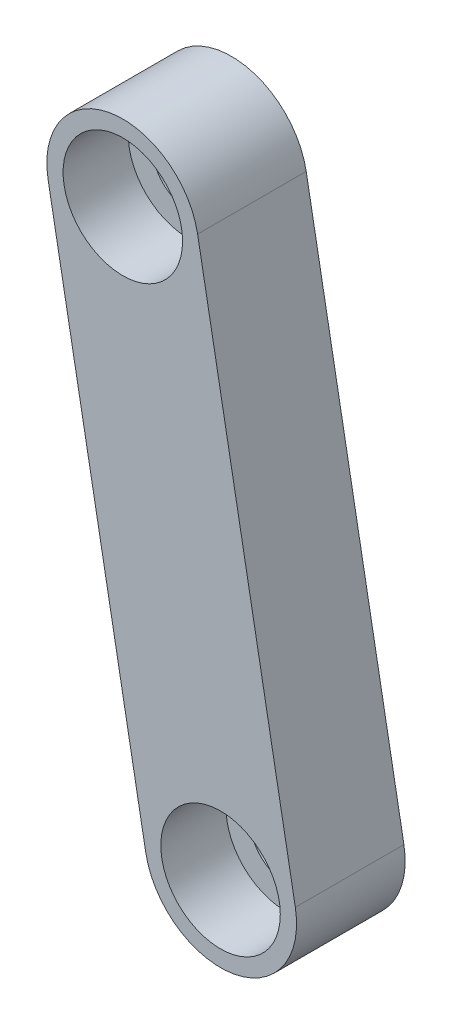
ISO-10303-21;
HEADER;
FILE_DESCRIPTION(('STEP AP214'),'2;1');
FILE_NAME('part.step','',(''),(''),'','','');
FILE_SCHEMA(('AUTOMOTIVE_DESIGN { 1 0 10303 214 1 1 1 1 }'));
ENDSEC;
DATA;
#1=APPLICATION_CONTEXT('core data for automotive mechanical design processes');
#2=APPLICATION_PROTOCOL_DEFINITION('international standard','automotive_design',2000,#1);
#3=PRODUCT_CONTEXT('',#1,'mechanical');
#4=PRODUCT('Part','Part','',(#3));
#5=PRODUCT_RELATED_PRODUCT_CATEGORY('part','',(#4));
#6=PRODUCT_DEFINITION_FORMATION('','',#4);
#7=PRODUCT_DEFINITION_CONTEXT('part definition',#1,'design');
#8=PRODUCT_DEFINITION('design','',#6,#7);
#9=PRODUCT_DEFINITION_SHAPE('','',#8);
#10=(LENGTH_UNIT() NAMED_UNIT(*) SI_UNIT(.MILLI.,.METRE.));
#11=(NAMED_UNIT(*) PLANE_ANGLE_UNIT() SI_UNIT($,.RADIAN.));
#12=(NAMED_UNIT(*) SI_UNIT($,.STERADIAN.) SOLID_ANGLE_UNIT());
#13=UNCERTAINTY_MEASURE_WITH_UNIT(LENGTH_MEASURE(1.E-05),#10,'distance_accuracy_value','');
#14=(GEOMETRIC_REPRESENTATION_CONTEXT(3) GLOBAL_UNCERTAINTY_ASSIGNED_CONTEXT((#13)) GLOBAL_UNIT_ASSIGNED_CONTEXT((#10,
#11,#12)) REPRESENTATION_CONTEXT('',''));
#15=CARTESIAN_POINT('',(0.,0.,0.));
#16=DIRECTION('',(0.,0.,1.));
#17=DIRECTION('',(1.,0.,0.));
#18=AXIS2_PLACEMENT_3D('',#15,#16,#17);
#19=CARTESIAN_POINT('',(-6.60998008883973,32.2171318150947,5.));
#20=DIRECTION('',(0.,0.,-1.));
#21=DIRECTION('',(-1.,0.,0.));
#22=AXIS2_PLACEMENT_3D('',#19,#20,#21);
#23=CYLINDRICAL_SURFACE('',#22,1.625);
#24=CARTESIAN_POINT('',(-6.60998008883973,32.2171318150947,0.));
#25=DIRECTION('',(0.,0.,1.));
#26=DIRECTION('',(1.,0.,0.));
#27=AXIS2_PLACEMENT_3D('',#24,#25,#26);
#28=CIRCLE('',#27,1.625);
#29=CARTESIAN_POINT('',(-4.98498008883973,32.2171318150947,0.));
#30=VERTEX_POINT('',#29);
#31=EDGE_CURVE('E103',#30,#30,#28,.T.);
#32=ORIENTED_EDGE('',*,*,#31,.F.);
#33=EDGE_LOOP('',(#32));
#34=FACE_BOUND('',#33,.T.);
#35=CARTESIAN_POINT('',(-6.60998008883973,32.2171318150947,2.));
#36=DIRECTION('',(0.,0.,1.));
#37=DIRECTION('',(1.,0.,0.));
#38=AXIS2_PLACEMENT_3D('',#35,#36,#37);
#39=CIRCLE('',#38,1.625);
#40=CARTESIAN_POINT('',(-4.98498008883973,32.2171318150947,2.));
#41=VERTEX_POINT('',#40);
#42=EDGE_CURVE('E37',#41,#41,#39,.T.);
#43=ORIENTED_EDGE('',*,*,#42,.T.);
#44=EDGE_LOOP('',(#43));
#45=FACE_BOUND('',#44,.T.);
#46=ADVANCED_FACE('F33',(#34,#45),#23,.F.);
#47=CARTESIAN_POINT('',(-11.1089160968687,56.8089917446661,5.));
#48=DIRECTION('',(0.,0.,-1.));
#49=DIRECTION('',(-1.,0.,0.));
#50=AXIS2_PLACEMENT_3D('',#47,#48,#49);
#51=CYLINDRICAL_SURFACE('',#50,1.625);
#52=CARTESIAN_POINT('',(-11.1089160968687,56.8089917446661,0.));
#53=DIRECTION('',(0.,0.,1.));
#54=DIRECTION('',(1.,0.,0.));
#55=AXIS2_PLACEMENT_3D('',#52,#53,#54);
#56=CIRCLE('',#55,1.625);
#57=CARTESIAN_POINT('',(-9.48391609686869,56.8089917446661,0.));
#58=VERTEX_POINT('',#57);
#59=EDGE_CURVE('E114',#58,#58,#56,.T.);
#60=ORIENTED_EDGE('',*,*,#59,.F.);
#61=EDGE_LOOP('',(#60));
#62=FACE_BOUND('',#61,.T.);
#63=CARTESIAN_POINT('',(-11.1089160968687,56.8089917446661,2.));
#64=DIRECTION('',(0.,0.,1.));
#65=DIRECTION('',(1.,0.,0.));
#66=AXIS2_PLACEMENT_3D('',#63,#64,#65);
#67=CIRCLE('',#66,1.625);
#68=CARTESIAN_POINT('',(-9.48391609686869,56.8089917446661,2.));
#69=VERTEX_POINT('',#68);
#70=EDGE_CURVE('E108',#69,#69,#67,.T.);
#71=ORIENTED_EDGE('',*,*,#70,.T.);
#72=EDGE_LOOP('',(#71));
#73=FACE_BOUND('',#72,.T.);
#74=ADVANCED_FACE('F139',(#62,#73),#51,.F.);
#75=CARTESIAN_POINT('',(-11.1089160963745,56.8089917447565,5.));
#76=DIRECTION('',(0.,0.,1.));
#77=DIRECTION('',(1.,0.,0.));
#78=AXIS2_PLACEMENT_3D('',#75,#76,#77);
#79=PLANE('',#78);
#80=CARTESIAN_POINT('',(-11.1089160968687,56.8089917446661,5.));
#81=DIRECTION('',(0.,0.,1.));
#82=DIRECTION('',(1.,0.,0.));
#83=AXIS2_PLACEMENT_3D('',#80,#81,#82);
#84=CIRCLE('',#83,2.75);
#85=CARTESIAN_POINT('',(-8.3589160968687,56.8089917446661,5.));
#86=VERTEX_POINT('',#85);
#87=EDGE_CURVE('E116',#86,#86,#84,.T.);
#88=ORIENTED_EDGE('',*,*,#87,.F.);
#89=EDGE_LOOP('',(#88));
#90=FACE_BOUND('',#89,.T.);
#91=CARTESIAN_POINT('',(-6.60998008883973,32.2171318150947,5.));
#92=DIRECTION('',(0.,0.,1.));
#93=DIRECTION('',(1.,0.,0.));
#94=AXIS2_PLACEMENT_3D('',#91,#92,#93);
#95=CIRCLE('',#94,2.75);
#96=CARTESIAN_POINT('',(-3.85998008883973,32.2171318150947,5.));
#97=VERTEX_POINT('',#96);
#98=EDGE_CURVE('E126',#97,#97,#95,.T.);
#99=ORIENTED_EDGE('',*,*,#98,.F.);
#100=EDGE_LOOP('',(#99));
#101=FACE_BOUND('',#100,.T.);
#102=CARTESIAN_POINT('',(-11.1089160963745,56.8089917447565,5.));
#103=DIRECTION('',(0.,0.,1.));
#104=DIRECTION('',(1.,0.,0.));
#105=AXIS2_PLACEMENT_3D('',#102,#103,#104);
#106=CIRCLE('',#105,3.5);
#107=CARTESIAN_POINT('',(-7.66605623646415,57.4388456841883,5.));
#108=VERTEX_POINT('',#107);
#109=CARTESIAN_POINT('',(-14.5517933346141,56.1792328048341,5.));
#110=VERTEX_POINT('',#109);
#111=EDGE_CURVE('E87',#108,#110,#106,.T.);
#112=ORIENTED_EDGE('',*,*,#111,.T.);
#113=DIRECTION('',(0.17993112569211,-0.983679210925579,0.));
#114=VECTOR('',#113,1.);
#115=CARTESIAN_POINT('',(-14.5517933346141,56.1792328048341,5.));
#116=LINE('',#115,#114);
#117=CARTESIAN_POINT('',(-10.0535226447267,31.5872932738733,5.));
#118=VERTEX_POINT('',#117);
#119=EDGE_CURVE('E82',#110,#118,#116,.T.);
#120=ORIENTED_EDGE('',*,*,#119,.T.);
#121=CARTESIAN_POINT('',(-6.61031481249932,32.2171617788635,5.));
#122=DIRECTION('',(0.,0.,1.));
#123=DIRECTION('',(1.,0.,0.));
#124=AXIS2_PLACEMENT_3D('',#121,#122,#123);
#125=CIRCLE('',#124,3.50034491293223);
#126=CARTESIAN_POINT('',(-3.16710698027193,32.8470302838536,5.));
#127=VERTEX_POINT('',#126);
#128=EDGE_CURVE('E85',#118,#127,#125,.T.);
#129=ORIENTED_EDGE('',*,*,#128,.T.);
#130=DIRECTION('',(-0.179958268389272,0.98367424569231,0.));
#131=VECTOR('',#130,1.);
#132=CARTESIAN_POINT('',(-3.16710698027194,32.8470302838536,5.));
#133=LINE('',#132,#131);
#134=EDGE_CURVE('E52',#127,#108,#133,.T.);
#135=ORIENTED_EDGE('',*,*,#134,.T.);
#136=EDGE_LOOP('',(#112,#120,#129,#135));
#137=FACE_BOUND('',#136,.T.);
#138=ADVANCED_FACE('F83',(#90,#101,#137),#79,.T.);
#139=CARTESIAN_POINT('',(-11.1089160963745,56.8089917447565,0.));
#140=DIRECTION('',(0.,0.,1.));
#141=DIRECTION('',(1.,0.,0.));
#142=AXIS2_PLACEMENT_3D('',#139,#140,#141);
#143=PLANE('',#142);
#144=CARTESIAN_POINT('',(-11.1089160963745,56.8089917447565,0.));
#145=DIRECTION('',(0.,0.,1.));
#146=DIRECTION('',(1.,0.,0.));
#147=AXIS2_PLACEMENT_3D('',#144,#145,#146);
#148=CIRCLE('',#147,3.5);
#149=CARTESIAN_POINT('',(-7.66605623646415,57.4388456841883,0.));
#150=VERTEX_POINT('',#149);
#151=CARTESIAN_POINT('',(-14.5517933346141,56.1792328048341,0.));
#152=VERTEX_POINT('',#151);
#153=EDGE_CURVE('E100',#150,#152,#148,.T.);
#154=ORIENTED_EDGE('',*,*,#153,.F.);
#155=DIRECTION('',(-0.179958268389272,0.98367424569231,0.));
#156=VECTOR('',#155,1.);
#157=CARTESIAN_POINT('',(-3.16710698027194,32.8470302838536,0.));
#158=LINE('',#157,#156);
#159=CARTESIAN_POINT('',(-3.16710698027193,32.8470302838536,0.));
#160=VERTEX_POINT('',#159);
#161=EDGE_CURVE('E75',#160,#150,#158,.T.);
#162=ORIENTED_EDGE('',*,*,#161,.F.);
#163=CARTESIAN_POINT('',(-6.61031481249932,32.2171617788635,0.));
#164=DIRECTION('',(0.,0.,1.));
#165=DIRECTION('',(1.,0.,0.));
#166=AXIS2_PLACEMENT_3D('',#163,#164,#165);
#167=CIRCLE('',#166,3.50034491293223);
#168=CARTESIAN_POINT('',(-10.0535226447267,31.5872932738733,0.));
#169=VERTEX_POINT('',#168);
#170=EDGE_CURVE('E69',#169,#160,#167,.T.);
#171=ORIENTED_EDGE('',*,*,#170,.F.);
#172=DIRECTION('',(0.17993112569211,-0.983679210925579,0.));
#173=VECTOR('',#172,1.);
#174=CARTESIAN_POINT('',(-14.5517933346141,56.1792328048341,0.));
#175=LINE('',#174,#173);
#176=EDGE_CURVE('E91',#152,#169,#175,.T.);
#177=ORIENTED_EDGE('',*,*,#176,.F.);
#178=EDGE_LOOP('',(#154,#162,#171,#177));
#179=FACE_BOUND('',#178,.T.);
#180=ORIENTED_EDGE('',*,*,#31,.T.);
#181=EDGE_LOOP('',(#180));
#182=FACE_BOUND('',#181,.T.);
#183=ORIENTED_EDGE('',*,*,#59,.T.);
#184=EDGE_LOOP('',(#183));
#185=FACE_BOUND('',#184,.T.);
#186=ADVANCED_FACE('F134',(#179,#182,#185),#143,.F.);
#187=CARTESIAN_POINT('',(-11.1089160963745,56.8089917447565,5.));
#188=DIRECTION('',(0.,0.,-1.));
#189=DIRECTION('',(-1.,0.,0.));
#190=AXIS2_PLACEMENT_3D('',#187,#188,#189);
#191=CYLINDRICAL_SURFACE('',#190,3.5);
#192=ORIENTED_EDGE('',*,*,#153,.T.);
#193=DIRECTION('',(0.,0.,-1.));
#194=VECTOR('',#193,1.);
#195=CARTESIAN_POINT('',(-14.5517933346141,56.1792328048341,5.));
#196=LINE('',#195,#194);
#197=EDGE_CURVE('E11',#110,#152,#196,.T.);
#198=ORIENTED_EDGE('',*,*,#197,.F.);
#199=ORIENTED_EDGE('',*,*,#111,.F.);
#200=DIRECTION('',(0.,0.,-1.));
#201=VECTOR('',#200,1.);
#202=CARTESIAN_POINT('',(-7.66605623646415,57.4388456841883,5.));
#203=LINE('',#202,#201);
#204=EDGE_CURVE('E96',#108,#150,#203,.T.);
#205=ORIENTED_EDGE('',*,*,#204,.T.);
#206=EDGE_LOOP('',(#192,#198,#199,#205));
#207=FACE_BOUND('',#206,.T.);
#208=ADVANCED_FACE('F35',(#207),#191,.T.);
#209=CARTESIAN_POINT('',(-14.5517933346141,56.1792328048341,5.));
#210=DIRECTION('',(0.983679210925579,0.17993112569211,0.));
#211=DIRECTION('',(-0.17993112569211,0.983679210925579,0.));
#212=AXIS2_PLACEMENT_3D('',#209,#210,#211);
#213=PLANE('',#212);
#214=ORIENTED_EDGE('',*,*,#176,.T.);
#215=DIRECTION('',(0.,0.,-1.));
#216=VECTOR('',#215,1.);
#217=CARTESIAN_POINT('',(-10.0535226447267,31.5872932738733,5.));
#218=LINE('',#217,#216);
#219=EDGE_CURVE('E43',#118,#169,#218,.T.);
#220=ORIENTED_EDGE('',*,*,#219,.F.);
#221=ORIENTED_EDGE('',*,*,#119,.F.);
#222=ORIENTED_EDGE('',*,*,#197,.T.);
#223=EDGE_LOOP('',(#214,#220,#221,#222));
#224=FACE_BOUND('',#223,.T.);
#225=ADVANCED_FACE('F90',(#224),#213,.F.);
#226=CARTESIAN_POINT('',(-6.61031481249932,32.2171617788635,5.));
#227=DIRECTION('',(0.,0.,-1.));
#228=DIRECTION('',(-1.,0.,0.));
#229=AXIS2_PLACEMENT_3D('',#226,#227,#228);
#230=CYLINDRICAL_SURFACE('',#229,3.50034491293223);
#231=ORIENTED_EDGE('',*,*,#170,.T.);
#232=DIRECTION('',(0.,0.,-1.));
#233=VECTOR('',#232,1.);
#234=CARTESIAN_POINT('',(-3.16710698027193,32.8470302838536,5.));
#235=LINE('',#234,#233);
#236=EDGE_CURVE('E92',#127,#160,#235,.T.);
#237=ORIENTED_EDGE('',*,*,#236,.F.);
#238=ORIENTED_EDGE('',*,*,#128,.F.);
#239=ORIENTED_EDGE('',*,*,#219,.T.);
#240=EDGE_LOOP('',(#231,#237,#238,#239));
#241=FACE_BOUND('',#240,.T.);
#242=ADVANCED_FACE('F94',(#241),#230,.T.);
#243=CARTESIAN_POINT('',(-3.16710698027194,32.8470302838536,5.));
#244=DIRECTION('',(-0.98367424569231,-0.179958268389272,0.));
#245=DIRECTION('',(0.179958268389272,-0.98367424569231,0.));
#246=AXIS2_PLACEMENT_3D('',#243,#244,#245);
#247=PLANE('',#246);
#248=ORIENTED_EDGE('',*,*,#161,.T.);
#249=ORIENTED_EDGE('',*,*,#204,.F.);
#250=ORIENTED_EDGE('',*,*,#134,.F.);
#251=ORIENTED_EDGE('',*,*,#236,.T.);
#252=EDGE_LOOP('',(#248,#249,#250,#251));
#253=FACE_BOUND('',#252,.T.);
#254=ADVANCED_FACE('F169',(#253),#247,.F.);
#255=CARTESIAN_POINT('',(-11.1089160968687,56.8089917446661,2.));
#256=DIRECTION('',(0.,0.,1.));
#257=DIRECTION('',(1.,0.,0.));
#258=AXIS2_PLACEMENT_3D('',#255,#256,#257);
#259=CYLINDRICAL_SURFACE('',#258,2.75);
#260=CARTESIAN_POINT('',(-11.1089160968687,56.8089917446661,2.));
#261=DIRECTION('',(0.,0.,1.));
#262=DIRECTION('',(1.,0.,0.));
#263=AXIS2_PLACEMENT_3D('',#260,#261,#262);
#264=CIRCLE('',#263,2.75);
#265=CARTESIAN_POINT('',(-8.3589160968687,56.8089917446661,2.));
#266=VERTEX_POINT('',#265);
#267=EDGE_CURVE('E110',#266,#266,#264,.T.);
#268=ORIENTED_EDGE('',*,*,#267,.F.);
#269=EDGE_LOOP('',(#268));
#270=FACE_BOUND('',#269,.T.);
#271=ORIENTED_EDGE('',*,*,#87,.T.);
#272=EDGE_LOOP('',(#271));
#273=FACE_BOUND('',#272,.T.);
#274=ADVANCED_FACE('F172',(#270,#273),#259,.F.);
#275=CARTESIAN_POINT('',(-11.1089160968687,56.8089917446661,2.));
#276=DIRECTION('',(0.,0.,1.));
#277=DIRECTION('',(1.,0.,0.));
#278=AXIS2_PLACEMENT_3D('',#275,#276,#277);
#279=PLANE('',#278);
#280=ORIENTED_EDGE('',*,*,#70,.F.);
#281=EDGE_LOOP('',(#280));
#282=FACE_BOUND('',#281,.T.);
#283=ORIENTED_EDGE('',*,*,#267,.T.);
#284=EDGE_LOOP('',(#283));
#285=FACE_BOUND('',#284,.T.);
#286=ADVANCED_FACE('F152',(#282,#285),#279,.T.);
#287=CARTESIAN_POINT('',(-6.60998008883973,32.2171318150947,2.));
#288=DIRECTION('',(0.,0.,1.));
#289=DIRECTION('',(1.,0.,0.));
#290=AXIS2_PLACEMENT_3D('',#287,#288,#289);
#291=CYLINDRICAL_SURFACE('',#290,2.75);
#292=CARTESIAN_POINT('',(-6.60998008883973,32.2171318150947,2.));
#293=DIRECTION('',(0.,0.,1.));
#294=DIRECTION('',(1.,0.,0.));
#295=AXIS2_PLACEMENT_3D('',#292,#293,#294);
#296=CIRCLE('',#295,2.75);
#297=CARTESIAN_POINT('',(-3.85998008883973,32.2171318150947,2.));
#298=VERTEX_POINT('',#297);
#299=EDGE_CURVE('E121',#298,#298,#296,.T.);
#300=ORIENTED_EDGE('',*,*,#299,.F.);
#301=EDGE_LOOP('',(#300));
#302=FACE_BOUND('',#301,.T.);
#303=ORIENTED_EDGE('',*,*,#98,.T.);
#304=EDGE_LOOP('',(#303));
#305=FACE_BOUND('',#304,.T.);
#306=ADVANCED_FACE('F146',(#302,#305),#291,.F.);
#307=CARTESIAN_POINT('',(-6.60998008883973,32.2171318150947,2.));
#308=DIRECTION('',(0.,0.,1.));
#309=DIRECTION('',(1.,0.,0.));
#310=AXIS2_PLACEMENT_3D('',#307,#308,#309);
#311=PLANE('',#310);
#312=ORIENTED_EDGE('',*,*,#42,.F.);
#313=EDGE_LOOP('',(#312));
#314=FACE_BOUND('',#313,.T.);
#315=ORIENTED_EDGE('',*,*,#299,.T.);
#316=EDGE_LOOP('',(#315));
#317=FACE_BOUND('',#316,.T.);
#318=ADVANCED_FACE('F143',(#314,#317),#311,.T.);
#319=CLOSED_SHELL('',(#46,#74,#138,#186,#208,#225,#242,#254,#274,#286,#306,#318));
#320=MANIFOLD_SOLID_BREP('B2',#319);
#321=ADVANCED_BREP_SHAPE_REPRESENTATION('',(#18,#320),#14);
#322=SHAPE_DEFINITION_REPRESENTATION(#9,#321);
ENDSEC;
END-ISO-10303-21;
